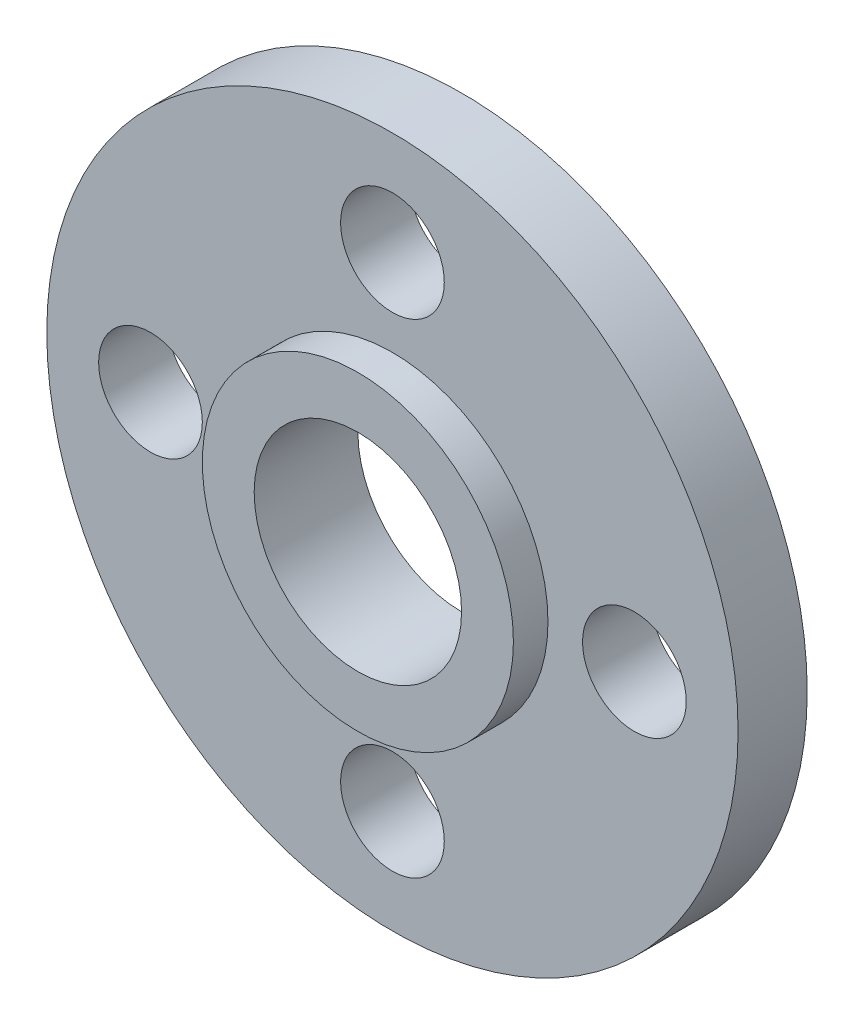
ISO-10303-21;
HEADER;
FILE_DESCRIPTION(('STEP AP214'),'2;1');
FILE_NAME('part.step','',(''),(''),'','','');
FILE_SCHEMA(('AUTOMOTIVE_DESIGN { 1 0 10303 214 1 1 1 1 }'));
ENDSEC;
DATA;
#1=APPLICATION_CONTEXT('core data for automotive mechanical design processes');
#2=APPLICATION_PROTOCOL_DEFINITION('international standard','automotive_design',2000,#1);
#3=PRODUCT_CONTEXT('',#1,'mechanical');
#4=PRODUCT('Part','Part','',(#3));
#5=PRODUCT_RELATED_PRODUCT_CATEGORY('part','',(#4));
#6=PRODUCT_DEFINITION_FORMATION('','',#4);
#7=PRODUCT_DEFINITION_CONTEXT('part definition',#1,'design');
#8=PRODUCT_DEFINITION('design','',#6,#7);
#9=PRODUCT_DEFINITION_SHAPE('','',#8);
#10=(LENGTH_UNIT() NAMED_UNIT(*) SI_UNIT(.MILLI.,.METRE.));
#11=(NAMED_UNIT(*) PLANE_ANGLE_UNIT() SI_UNIT($,.RADIAN.));
#12=(NAMED_UNIT(*) SI_UNIT($,.STERADIAN.) SOLID_ANGLE_UNIT());
#13=UNCERTAINTY_MEASURE_WITH_UNIT(LENGTH_MEASURE(1.E-05),#10,'distance_accuracy_value','');
#14=(GEOMETRIC_REPRESENTATION_CONTEXT(3) GLOBAL_UNCERTAINTY_ASSIGNED_CONTEXT((#13)) GLOBAL_UNIT_ASSIGNED_CONTEXT((#10,
#11,#12)) REPRESENTATION_CONTEXT('',''));
#15=CARTESIAN_POINT('',(0.,0.,0.));
#16=DIRECTION('',(0.,0.,1.));
#17=DIRECTION('',(1.,0.,0.));
#18=AXIS2_PLACEMENT_3D('',#15,#16,#17);
#19=CARTESIAN_POINT('',(0.,0.,4.5));
#20=DIRECTION('',(0.,0.,-1.));
#21=DIRECTION('',(-1.,0.,0.));
#22=AXIS2_PLACEMENT_3D('',#19,#20,#21);
#23=CYLINDRICAL_SURFACE('',#22,4.5);
#24=CARTESIAN_POINT('',(0.,0.,2.));
#25=DIRECTION('',(0.,0.,1.));
#26=DIRECTION('',(1.,0.,0.));
#27=AXIS2_PLACEMENT_3D('',#24,#25,#26);
#28=CIRCLE('',#27,4.5);
#29=CARTESIAN_POINT('',(4.5,0.,2.));
#30=VERTEX_POINT('',#29);
#31=EDGE_CURVE('E52',#30,#30,#28,.T.);
#32=ORIENTED_EDGE('',*,*,#31,.T.);
#33=EDGE_LOOP('',(#32));
#34=FACE_BOUND('',#33,.T.);
#35=CARTESIAN_POINT('',(0.,0.,3.));
#36=DIRECTION('',(0.,0.,1.));
#37=DIRECTION('',(1.,0.,0.));
#38=AXIS2_PLACEMENT_3D('',#35,#36,#37);
#39=CIRCLE('',#38,4.5);
#40=CARTESIAN_POINT('',(4.5,0.,3.));
#41=VERTEX_POINT('',#40);
#42=EDGE_CURVE('E53',#41,#41,#39,.T.);
#43=ORIENTED_EDGE('',*,*,#42,.F.);
#44=EDGE_LOOP('',(#43));
#45=FACE_BOUND('',#44,.T.);
#46=ADVANCED_FACE('F32',(#34,#45),#23,.T.);
#47=CARTESIAN_POINT('',(0.,0.,4.5));
#48=DIRECTION('',(0.,0.,-1.));
#49=DIRECTION('',(-1.,0.,0.));
#50=AXIS2_PLACEMENT_3D('',#47,#48,#49);
#51=CYLINDRICAL_SURFACE('',#50,3.);
#52=CARTESIAN_POINT('',(0.,0.,0.));
#53=DIRECTION('',(0.,0.,1.));
#54=DIRECTION('',(1.,0.,0.));
#55=AXIS2_PLACEMENT_3D('',#52,#53,#54);
#56=CIRCLE('',#55,3.);
#57=CARTESIAN_POINT('',(3.,0.,0.));
#58=VERTEX_POINT('',#57);
#59=EDGE_CURVE('E40',#58,#58,#56,.T.);
#60=ORIENTED_EDGE('',*,*,#59,.F.);
#61=EDGE_LOOP('',(#60));
#62=FACE_BOUND('',#61,.T.);
#63=CARTESIAN_POINT('',(0.,0.,3.));
#64=DIRECTION('',(0.,0.,1.));
#65=DIRECTION('',(1.,0.,0.));
#66=AXIS2_PLACEMENT_3D('',#63,#64,#65);
#67=CIRCLE('',#66,3.);
#68=CARTESIAN_POINT('',(3.,0.,3.));
#69=VERTEX_POINT('',#68);
#70=EDGE_CURVE('E49',#69,#69,#67,.T.);
#71=ORIENTED_EDGE('',*,*,#70,.T.);
#72=EDGE_LOOP('',(#71));
#73=FACE_BOUND('',#72,.T.);
#74=ADVANCED_FACE('F86',(#62,#73),#51,.F.);
#75=CARTESIAN_POINT('',(0.,0.,2.5));
#76=DIRECTION('',(0.,0.,-1.));
#77=DIRECTION('',(-1.,0.,0.));
#78=AXIS2_PLACEMENT_3D('',#75,#76,#77);
#79=CYLINDRICAL_SURFACE('',#78,10.);
#80=CARTESIAN_POINT('',(0.,0.,0.));
#81=DIRECTION('',(0.,0.,1.));
#82=DIRECTION('',(1.,0.,0.));
#83=AXIS2_PLACEMENT_3D('',#80,#81,#82);
#84=CIRCLE('',#83,10.);
#85=CARTESIAN_POINT('',(10.,0.,0.));
#86=VERTEX_POINT('',#85);
#87=EDGE_CURVE('E10',#86,#86,#84,.T.);
#88=ORIENTED_EDGE('',*,*,#87,.T.);
#89=EDGE_LOOP('',(#88));
#90=FACE_BOUND('',#89,.T.);
#91=CARTESIAN_POINT('',(0.,0.,2.));
#92=DIRECTION('',(0.,0.,1.));
#93=DIRECTION('',(1.,0.,0.));
#94=AXIS2_PLACEMENT_3D('',#91,#92,#93);
#95=CIRCLE('',#94,10.);
#96=CARTESIAN_POINT('',(10.,0.,2.));
#97=VERTEX_POINT('',#96);
#98=EDGE_CURVE('E45',#97,#97,#95,.T.);
#99=ORIENTED_EDGE('',*,*,#98,.F.);
#100=EDGE_LOOP('',(#99));
#101=FACE_BOUND('',#100,.T.);
#102=ADVANCED_FACE('F34',(#90,#101),#79,.T.);
#103=CARTESIAN_POINT('',(0.,0.,0.));
#104=DIRECTION('',(0.,0.,1.));
#105=DIRECTION('',(1.,0.,0.));
#106=AXIS2_PLACEMENT_3D('',#103,#104,#105);
#107=PLANE('',#106);
#108=CARTESIAN_POINT('',(-7.0000000000002,1.98094713253425E-13,0.));
#109=DIRECTION('',(0.,0.,-1.));
#110=DIRECTION('',(-1.,0.,0.));
#111=AXIS2_PLACEMENT_3D('',#108,#109,#110);
#112=CIRCLE('',#111,1.50000000000015);
#113=CARTESIAN_POINT('',(-8.50000000000036,1.98094713253425E-13,0.));
#114=VERTEX_POINT('',#113);
#115=EDGE_CURVE('E61',#114,#114,#112,.T.);
#116=ORIENTED_EDGE('',*,*,#115,.F.);
#117=EDGE_LOOP('',(#116));
#118=FACE_BOUND('',#117,.T.);
#119=CARTESIAN_POINT('',(-3.9618942650685E-13,-7.,0.));
#120=DIRECTION('',(0.,0.,-1.));
#121=DIRECTION('',(-1.,0.,0.));
#122=AXIS2_PLACEMENT_3D('',#119,#120,#121);
#123=CIRCLE('',#122,1.50000000000043);
#124=CARTESIAN_POINT('',(-1.50000000000082,-7.,0.));
#125=VERTEX_POINT('',#124);
#126=EDGE_CURVE('E126',#125,#125,#123,.T.);
#127=ORIENTED_EDGE('',*,*,#126,.F.);
#128=EDGE_LOOP('',(#127));
#129=FACE_BOUND('',#128,.T.);
#130=CARTESIAN_POINT('',(6.9999999999998,-1.98951966012828E-13,0.));
#131=DIRECTION('',(0.,0.,-1.));
#132=DIRECTION('',(-1.,0.,0.));
#133=AXIS2_PLACEMENT_3D('',#130,#131,#132);
#134=CIRCLE('',#133,1.50000000000032);
#135=CARTESIAN_POINT('',(5.49999999999949,-1.98951966012828E-13,0.));
#136=VERTEX_POINT('',#135);
#137=EDGE_CURVE('E74',#136,#136,#134,.T.);
#138=ORIENTED_EDGE('',*,*,#137,.F.);
#139=EDGE_LOOP('',(#138));
#140=FACE_BOUND('',#139,.T.);
#141=CARTESIAN_POINT('',(0.,7.,0.));
#142=DIRECTION('',(0.,0.,-1.));
#143=DIRECTION('',(-1.,0.,0.));
#144=AXIS2_PLACEMENT_3D('',#141,#142,#143);
#145=CIRCLE('',#144,1.5);
#146=CARTESIAN_POINT('',(-1.5,7.,0.));
#147=VERTEX_POINT('',#146);
#148=EDGE_CURVE('E57',#147,#147,#145,.T.);
#149=ORIENTED_EDGE('',*,*,#148,.F.);
#150=EDGE_LOOP('',(#149));
#151=FACE_BOUND('',#150,.T.);
#152=ORIENTED_EDGE('',*,*,#59,.T.);
#153=EDGE_LOOP('',(#152));
#154=FACE_BOUND('',#153,.T.);
#155=ORIENTED_EDGE('',*,*,#87,.F.);
#156=EDGE_LOOP('',(#155));
#157=FACE_BOUND('',#156,.T.);
#158=ADVANCED_FACE('F85',(#118,#129,#140,#151,#154,#157),#107,.F.);
#159=CARTESIAN_POINT('',(0.,0.,2.));
#160=DIRECTION('',(0.,0.,1.));
#161=DIRECTION('',(1.,0.,0.));
#162=AXIS2_PLACEMENT_3D('',#159,#160,#161);
#163=PLANE('',#162);
#164=CARTESIAN_POINT('',(-7.0000000000002,1.98094713253425E-13,2.));
#165=DIRECTION('',(0.,0.,1.));
#166=DIRECTION('',(1.,0.,0.));
#167=AXIS2_PLACEMENT_3D('',#164,#165,#166);
#168=CIRCLE('',#167,1.50000000000015);
#169=CARTESIAN_POINT('',(-5.50000000000004,1.98094713253425E-13,2.));
#170=VERTEX_POINT('',#169);
#171=EDGE_CURVE('E36',#170,#170,#168,.T.);
#172=ORIENTED_EDGE('',*,*,#171,.F.);
#173=EDGE_LOOP('',(#172));
#174=FACE_BOUND('',#173,.T.);
#175=CARTESIAN_POINT('',(-3.9618942650685E-13,-7.,2.));
#176=DIRECTION('',(0.,0.,1.));
#177=DIRECTION('',(1.,0.,0.));
#178=AXIS2_PLACEMENT_3D('',#175,#176,#177);
#179=CIRCLE('',#178,1.50000000000043);
#180=CARTESIAN_POINT('',(1.50000000000003,-7.,2.));
#181=VERTEX_POINT('',#180);
#182=EDGE_CURVE('E60',#181,#181,#179,.T.);
#183=ORIENTED_EDGE('',*,*,#182,.F.);
#184=EDGE_LOOP('',(#183));
#185=FACE_BOUND('',#184,.T.);
#186=CARTESIAN_POINT('',(6.9999999999998,-1.98951966012828E-13,2.));
#187=DIRECTION('',(0.,0.,1.));
#188=DIRECTION('',(1.,0.,0.));
#189=AXIS2_PLACEMENT_3D('',#186,#187,#188);
#190=CIRCLE('',#189,1.50000000000032);
#191=CARTESIAN_POINT('',(8.50000000000012,-1.98951966012828E-13,2.));
#192=VERTEX_POINT('',#191);
#193=EDGE_CURVE('E58',#192,#192,#190,.T.);
#194=ORIENTED_EDGE('',*,*,#193,.F.);
#195=EDGE_LOOP('',(#194));
#196=FACE_BOUND('',#195,.T.);
#197=CARTESIAN_POINT('',(0.,7.,2.));
#198=DIRECTION('',(0.,0.,1.));
#199=DIRECTION('',(1.,0.,0.));
#200=AXIS2_PLACEMENT_3D('',#197,#198,#199);
#201=CIRCLE('',#200,1.5);
#202=CARTESIAN_POINT('',(1.5,7.,2.));
#203=VERTEX_POINT('',#202);
#204=EDGE_CURVE('E54',#203,#203,#201,.T.);
#205=ORIENTED_EDGE('',*,*,#204,.F.);
#206=EDGE_LOOP('',(#205));
#207=FACE_BOUND('',#206,.T.);
#208=ORIENTED_EDGE('',*,*,#31,.F.);
#209=EDGE_LOOP('',(#208));
#210=FACE_BOUND('',#209,.T.);
#211=ORIENTED_EDGE('',*,*,#98,.T.);
#212=EDGE_LOOP('',(#211));
#213=FACE_BOUND('',#212,.T.);
#214=ADVANCED_FACE('F82',(#174,#185,#196,#207,#210,#213),#163,.T.);
#215=CARTESIAN_POINT('',(0.,0.,3.));
#216=DIRECTION('',(0.,0.,1.));
#217=DIRECTION('',(1.,0.,0.));
#218=AXIS2_PLACEMENT_3D('',#215,#216,#217);
#219=PLANE('',#218);
#220=ORIENTED_EDGE('',*,*,#70,.F.);
#221=EDGE_LOOP('',(#220));
#222=FACE_BOUND('',#221,.T.);
#223=ORIENTED_EDGE('',*,*,#42,.T.);
#224=EDGE_LOOP('',(#223));
#225=FACE_BOUND('',#224,.T.);
#226=ADVANCED_FACE('F103',(#222,#225),#219,.T.);
#227=CARTESIAN_POINT('',(0.,7.,12.3));
#228=DIRECTION('',(0.,0.,-1.));
#229=DIRECTION('',(-1.,0.,0.));
#230=AXIS2_PLACEMENT_3D('',#227,#228,#229);
#231=CYLINDRICAL_SURFACE('',#230,1.5);
#232=ORIENTED_EDGE('',*,*,#204,.T.);
#233=EDGE_LOOP('',(#232));
#234=FACE_BOUND('',#233,.T.);
#235=ORIENTED_EDGE('',*,*,#148,.T.);
#236=EDGE_LOOP('',(#235));
#237=FACE_BOUND('',#236,.T.);
#238=ADVANCED_FACE('F107',(#234,#237),#231,.F.);
#239=CARTESIAN_POINT('',(6.9999999999998,-1.98951966012828E-13,12.3));
#240=DIRECTION('',(0.,0.,-1.));
#241=DIRECTION('',(-1.,0.,0.));
#242=AXIS2_PLACEMENT_3D('',#239,#240,#241);
#243=CYLINDRICAL_SURFACE('',#242,1.50000000000032);
#244=ORIENTED_EDGE('',*,*,#193,.T.);
#245=EDGE_LOOP('',(#244));
#246=FACE_BOUND('',#245,.T.);
#247=ORIENTED_EDGE('',*,*,#137,.T.);
#248=EDGE_LOOP('',(#247));
#249=FACE_BOUND('',#248,.T.);
#250=ADVANCED_FACE('F111',(#246,#249),#243,.F.);
#251=CARTESIAN_POINT('',(-3.9618942650685E-13,-7.,12.3));
#252=DIRECTION('',(0.,0.,-1.));
#253=DIRECTION('',(-1.,0.,0.));
#254=AXIS2_PLACEMENT_3D('',#251,#252,#253);
#255=CYLINDRICAL_SURFACE('',#254,1.50000000000043);
#256=ORIENTED_EDGE('',*,*,#182,.T.);
#257=EDGE_LOOP('',(#256));
#258=FACE_BOUND('',#257,.T.);
#259=ORIENTED_EDGE('',*,*,#126,.T.);
#260=EDGE_LOOP('',(#259));
#261=FACE_BOUND('',#260,.T.);
#262=ADVANCED_FACE('F115',(#258,#261),#255,.F.);
#263=CARTESIAN_POINT('',(-7.0000000000002,1.98094713253425E-13,12.3));
#264=DIRECTION('',(0.,0.,-1.));
#265=DIRECTION('',(-1.,0.,0.));
#266=AXIS2_PLACEMENT_3D('',#263,#264,#265);
#267=CYLINDRICAL_SURFACE('',#266,1.50000000000015);
#268=ORIENTED_EDGE('',*,*,#171,.T.);
#269=EDGE_LOOP('',(#268));
#270=FACE_BOUND('',#269,.T.);
#271=ORIENTED_EDGE('',*,*,#115,.T.);
#272=EDGE_LOOP('',(#271));
#273=FACE_BOUND('',#272,.T.);
#274=ADVANCED_FACE('F119',(#270,#273),#267,.F.);
#275=CLOSED_SHELL('',(#46,#74,#102,#158,#214,#226,#238,#250,#262,#274));
#276=MANIFOLD_SOLID_BREP('B2',#275);
#277=ADVANCED_BREP_SHAPE_REPRESENTATION('',(#18,#276),#14);
#278=SHAPE_DEFINITION_REPRESENTATION(#9,#277);
ENDSEC;
END-ISO-10303-21;
